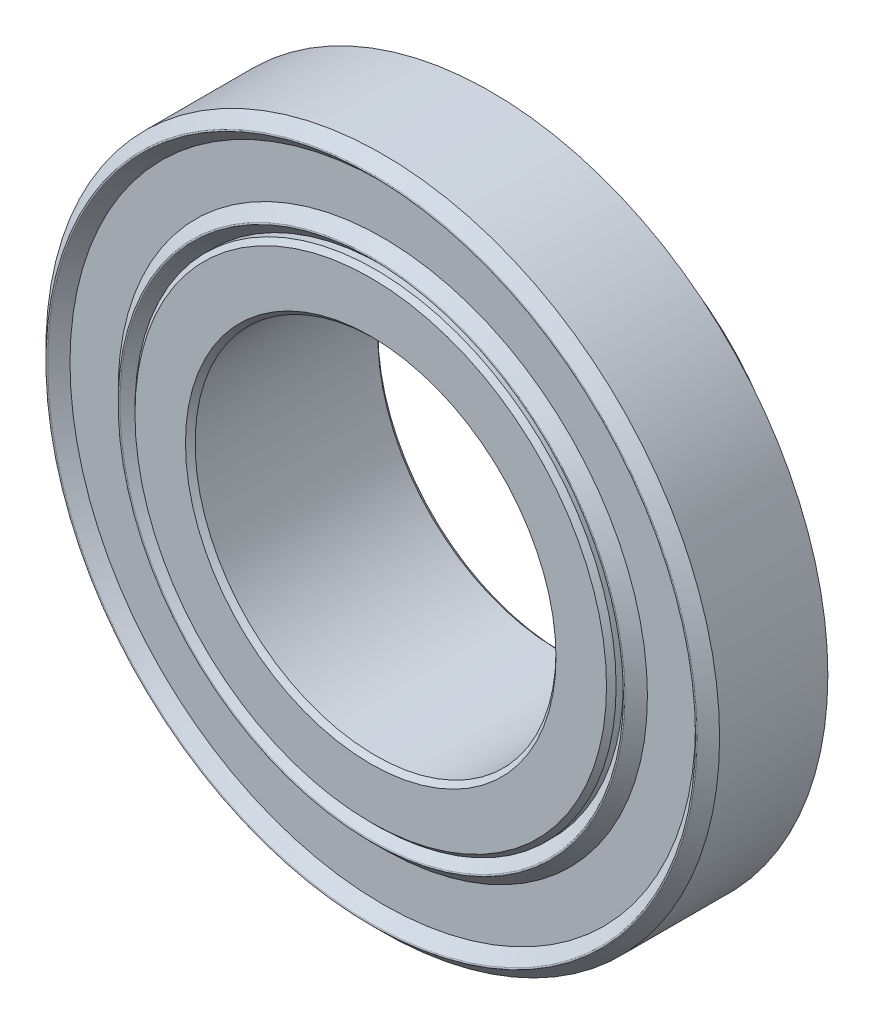
ISO-10303-21;
HEADER;
FILE_DESCRIPTION(('STEP AP214'),'2;1');
FILE_NAME('part.step','',(''),(''),'','','');
FILE_SCHEMA(('AUTOMOTIVE_DESIGN { 1 0 10303 214 1 1 1 1 }'));
ENDSEC;
DATA;
#1=APPLICATION_CONTEXT('core data for automotive mechanical design processes');
#2=APPLICATION_PROTOCOL_DEFINITION('international standard','automotive_design',2000,#1);
#3=PRODUCT_CONTEXT('',#1,'mechanical');
#4=PRODUCT('Part','Part','',(#3));
#5=PRODUCT_RELATED_PRODUCT_CATEGORY('part','',(#4));
#6=PRODUCT_DEFINITION_FORMATION('','',#4);
#7=PRODUCT_DEFINITION_CONTEXT('part definition',#1,'design');
#8=PRODUCT_DEFINITION('design','',#6,#7);
#9=PRODUCT_DEFINITION_SHAPE('','',#8);
#10=(LENGTH_UNIT() NAMED_UNIT(*) SI_UNIT(.MILLI.,.METRE.));
#11=(NAMED_UNIT(*) PLANE_ANGLE_UNIT() SI_UNIT($,.RADIAN.));
#12=(NAMED_UNIT(*) SI_UNIT($,.STERADIAN.) SOLID_ANGLE_UNIT());
#13=UNCERTAINTY_MEASURE_WITH_UNIT(LENGTH_MEASURE(1.E-05),#10,'distance_accuracy_value','');
#14=(GEOMETRIC_REPRESENTATION_CONTEXT(3) GLOBAL_UNCERTAINTY_ASSIGNED_CONTEXT((#13)) GLOBAL_UNIT_ASSIGNED_CONTEXT((#10,
#11,#12)) REPRESENTATION_CONTEXT('',''));
#15=CARTESIAN_POINT('',(0.,0.,0.));
#16=DIRECTION('',(0.,0.,1.));
#17=DIRECTION('',(1.,0.,0.));
#18=AXIS2_PLACEMENT_3D('',#15,#16,#17);
#19=CARTESIAN_POINT('',(0.,0.,-8.));
#20=DIRECTION('',(0.,0.,1.));
#21=DIRECTION('',(1.,0.,0.));
#22=AXIS2_PLACEMENT_3D('',#19,#20,#21);
#23=CYLINDRICAL_SURFACE('',#22,10.);
#24=CARTESIAN_POINT('',(0.,0.,-7.8));
#25=DIRECTION('',(0.,0.,1.));
#26=DIRECTION('',(1.,0.,0.));
#27=AXIS2_PLACEMENT_3D('',#24,#25,#26);
#28=CIRCLE('',#27,10.);
#29=CARTESIAN_POINT('',(10.,0.,-7.8));
#30=VERTEX_POINT('',#29);
#31=EDGE_CURVE('E53',#30,#30,#28,.T.);
#32=ORIENTED_EDGE('',*,*,#31,.T.);
#33=EDGE_LOOP('',(#32));
#34=FACE_BOUND('',#33,.T.);
#35=CARTESIAN_POINT('',(0.,0.,-0.199999999999997));
#36=DIRECTION('',(0.,0.,1.));
#37=DIRECTION('',(1.,0.,0.));
#38=AXIS2_PLACEMENT_3D('',#35,#36,#37);
#39=CIRCLE('',#38,10.);
#40=CARTESIAN_POINT('',(10.,0.,-0.199999999999997));
#41=VERTEX_POINT('',#40);
#42=EDGE_CURVE('E57',#41,#41,#39,.F.);
#43=ORIENTED_EDGE('',*,*,#42,.T.);
#44=EDGE_LOOP('',(#43));
#45=FACE_BOUND('',#44,.T.);
#46=ADVANCED_FACE('F42',(#34,#45),#23,.T.);
#47=CARTESIAN_POINT('',(0.,0.,-8.));
#48=DIRECTION('',(0.,0.,1.));
#49=DIRECTION('',(1.,0.,0.));
#50=AXIS2_PLACEMENT_3D('',#47,#48,#49);
#51=PLANE('',#50);
#52=CARTESIAN_POINT('',(0.,0.,-8.));
#53=DIRECTION('',(0.,0.,1.));
#54=DIRECTION('',(1.,0.,0.));
#55=AXIS2_PLACEMENT_3D('',#52,#53,#54);
#56=CIRCLE('',#55,7.7);
#57=CARTESIAN_POINT('',(7.7,0.,-8.));
#58=VERTEX_POINT('',#57);
#59=EDGE_CURVE('E68',#58,#58,#56,.T.);
#60=ORIENTED_EDGE('',*,*,#59,.T.);
#61=EDGE_LOOP('',(#60));
#62=FACE_BOUND('',#61,.T.);
#63=CARTESIAN_POINT('',(0.,0.,-8.));
#64=DIRECTION('',(0.,0.,1.));
#65=DIRECTION('',(1.,0.,0.));
#66=AXIS2_PLACEMENT_3D('',#63,#64,#65);
#67=CIRCLE('',#66,9.8);
#68=CARTESIAN_POINT('',(9.8,0.,-8.));
#69=VERTEX_POINT('',#68);
#70=EDGE_CURVE('E71',#69,#69,#67,.F.);
#71=ORIENTED_EDGE('',*,*,#70,.T.);
#72=EDGE_LOOP('',(#71));
#73=FACE_BOUND('',#72,.T.);
#74=ADVANCED_FACE('F75',(#62,#73),#51,.F.);
#75=CARTESIAN_POINT('',(0.,0.,0.));
#76=DIRECTION('',(0.,0.,1.));
#77=DIRECTION('',(1.,0.,0.));
#78=AXIS2_PLACEMENT_3D('',#75,#76,#77);
#79=PLANE('',#78);
#80=CARTESIAN_POINT('',(0.,0.,0.));
#81=DIRECTION('',(0.,0.,1.));
#82=DIRECTION('',(1.,0.,0.));
#83=AXIS2_PLACEMENT_3D('',#80,#81,#82);
#84=CIRCLE('',#83,7.7);
#85=CARTESIAN_POINT('',(7.7,0.,0.));
#86=VERTEX_POINT('',#85);
#87=EDGE_CURVE('E11',#86,#86,#84,.F.);
#88=ORIENTED_EDGE('',*,*,#87,.T.);
#89=EDGE_LOOP('',(#88));
#90=FACE_BOUND('',#89,.T.);
#91=CARTESIAN_POINT('',(0.,0.,0.));
#92=DIRECTION('',(0.,0.,1.));
#93=DIRECTION('',(1.,0.,0.));
#94=AXIS2_PLACEMENT_3D('',#91,#92,#93);
#95=CIRCLE('',#94,9.8);
#96=CARTESIAN_POINT('',(9.8,0.,0.));
#97=VERTEX_POINT('',#96);
#98=EDGE_CURVE('E49',#97,#97,#95,.T.);
#99=ORIENTED_EDGE('',*,*,#98,.T.);
#100=EDGE_LOOP('',(#99));
#101=FACE_BOUND('',#100,.T.);
#102=ADVANCED_FACE('F104',(#90,#101),#79,.T.);
#103=CARTESIAN_POINT('',(0.,0.,-8.));
#104=DIRECTION('',(0.,0.,1.));
#105=DIRECTION('',(1.,0.,0.));
#106=AXIS2_PLACEMENT_3D('',#103,#104,#105);
#107=CYLINDRICAL_SURFACE('',#106,7.5);
#108=CARTESIAN_POINT('',(0.,0.,-7.8));
#109=DIRECTION('',(0.,0.,1.));
#110=DIRECTION('',(1.,0.,0.));
#111=AXIS2_PLACEMENT_3D('',#108,#109,#110);
#112=CIRCLE('',#111,7.5);
#113=CARTESIAN_POINT('',(7.5,0.,-7.8));
#114=VERTEX_POINT('',#113);
#115=EDGE_CURVE('E62',#114,#114,#112,.F.);
#116=ORIENTED_EDGE('',*,*,#115,.T.);
#117=EDGE_LOOP('',(#116));
#118=FACE_BOUND('',#117,.T.);
#119=CARTESIAN_POINT('',(0.,0.,-0.200000000000001));
#120=DIRECTION('',(0.,0.,1.));
#121=DIRECTION('',(1.,0.,0.));
#122=AXIS2_PLACEMENT_3D('',#119,#120,#121);
#123=CIRCLE('',#122,7.5);
#124=CARTESIAN_POINT('',(7.5,0.,-0.200000000000001));
#125=VERTEX_POINT('',#124);
#126=EDGE_CURVE('E65',#125,#125,#123,.T.);
#127=ORIENTED_EDGE('',*,*,#126,.T.);
#128=EDGE_LOOP('',(#127));
#129=FACE_BOUND('',#128,.T.);
#130=ADVANCED_FACE('F101',(#118,#129),#107,.F.);
#131=CARTESIAN_POINT('',(0.,0.,-8.));
#132=DIRECTION('',(0.,0.,-1.));
#133=DIRECTION('',(-1.,0.,0.));
#134=AXIS2_PLACEMENT_3D('',#131,#132,#133);
#135=CONICAL_SURFACE('',#134,7.7,0.785398163397448);
#136=ORIENTED_EDGE('',*,*,#115,.F.);
#137=EDGE_LOOP('',(#136));
#138=FACE_BOUND('',#137,.T.);
#139=ORIENTED_EDGE('',*,*,#59,.F.);
#140=EDGE_LOOP('',(#139));
#141=FACE_BOUND('',#140,.T.);
#142=ADVANCED_FACE('F81',(#138,#141),#135,.F.);
#143=CARTESIAN_POINT('',(0.,0.,-7.8));
#144=DIRECTION('',(0.,0.,1.));
#145=DIRECTION('',(1.,0.,0.));
#146=AXIS2_PLACEMENT_3D('',#143,#144,#145);
#147=CONICAL_SURFACE('',#146,10.,0.785398163397444);
#148=ORIENTED_EDGE('',*,*,#70,.F.);
#149=EDGE_LOOP('',(#148));
#150=FACE_BOUND('',#149,.T.);
#151=ORIENTED_EDGE('',*,*,#31,.F.);
#152=EDGE_LOOP('',(#151));
#153=FACE_BOUND('',#152,.T.);
#154=ADVANCED_FACE('F77',(#150,#153),#147,.T.);
#155=CARTESIAN_POINT('',(0.,0.,-0.200000000000001));
#156=DIRECTION('',(0.,0.,1.));
#157=DIRECTION('',(1.,0.,0.));
#158=AXIS2_PLACEMENT_3D('',#155,#156,#157);
#159=CONICAL_SURFACE('',#158,7.5,0.785398163397444);
#160=ORIENTED_EDGE('',*,*,#87,.F.);
#161=EDGE_LOOP('',(#160));
#162=FACE_BOUND('',#161,.T.);
#163=ORIENTED_EDGE('',*,*,#126,.F.);
#164=EDGE_LOOP('',(#163));
#165=FACE_BOUND('',#164,.T.);
#166=ADVANCED_FACE('F80',(#162,#165),#159,.F.);
#167=CARTESIAN_POINT('',(0.,0.,0.));
#168=DIRECTION('',(0.,0.,-1.));
#169=DIRECTION('',(-1.,0.,0.));
#170=AXIS2_PLACEMENT_3D('',#167,#168,#169);
#171=CONICAL_SURFACE('',#170,9.8,0.785398163397457);
#172=ORIENTED_EDGE('',*,*,#42,.F.);
#173=EDGE_LOOP('',(#172));
#174=FACE_BOUND('',#173,.T.);
#175=ORIENTED_EDGE('',*,*,#98,.F.);
#176=EDGE_LOOP('',(#175));
#177=FACE_BOUND('',#176,.T.);
#178=ADVANCED_FACE('F44',(#174,#177),#171,.T.);
#179=CLOSED_SHELL('',(#46,#74,#102,#130,#142,#154,#166,#178));
#180=MANIFOLD_SOLID_BREP('B2',#179);
#181=CARTESIAN_POINT('',(0.,0.,0.));
#182=DIRECTION('',(0.,0.,1.));
#183=DIRECTION('',(1.,0.,0.));
#184=AXIS2_PLACEMENT_3D('',#181,#182,#183);
#185=CYLINDRICAL_SURFACE('',#184,10.);
#186=CARTESIAN_POINT('',(0.,0.,-0.5));
#187=DIRECTION('',(0.,0.,1.));
#188=DIRECTION('',(1.,0.,0.));
#189=AXIS2_PLACEMENT_3D('',#186,#187,#188);
#190=CIRCLE('',#189,10.);
#191=CARTESIAN_POINT('',(10.,0.,-0.5));
#192=VERTEX_POINT('',#191);
#193=EDGE_CURVE('E197',#192,#192,#190,.T.);
#194=ORIENTED_EDGE('',*,*,#193,.T.);
#195=EDGE_LOOP('',(#194));
#196=FACE_BOUND('',#195,.T.);
#197=CARTESIAN_POINT('',(0.,0.,-5.));
#198=DIRECTION('',(0.,0.,1.));
#199=DIRECTION('',(1.,0.,0.));
#200=AXIS2_PLACEMENT_3D('',#197,#198,#199);
#201=CIRCLE('',#200,10.);
#202=CARTESIAN_POINT('',(10.,0.,-5.));
#203=VERTEX_POINT('',#202);
#204=EDGE_CURVE('E41',#203,#203,#201,.T.);
#205=ORIENTED_EDGE('',*,*,#204,.F.);
#206=EDGE_LOOP('',(#205));
#207=FACE_BOUND('',#206,.T.);
#208=ADVANCED_FACE('F163',(#196,#207),#185,.F.);
#209=CARTESIAN_POINT('',(10.,0.,-5.));
#210=DIRECTION('',(0.,0.,-1.));
#211=DIRECTION('',(-1.,0.,0.));
#212=AXIS2_PLACEMENT_3D('',#209,#210,#211);
#213=PLANE('',#212);
#214=ORIENTED_EDGE('',*,*,#204,.T.);
#215=EDGE_LOOP('',(#214));
#216=FACE_BOUND('',#215,.T.);
#217=CARTESIAN_POINT('',(0.,0.,-5.));
#218=DIRECTION('',(0.,0.,1.));
#219=DIRECTION('',(1.,0.,0.));
#220=AXIS2_PLACEMENT_3D('',#217,#218,#219);
#221=CIRCLE('',#220,14.);
#222=CARTESIAN_POINT('',(14.,0.,-5.));
#223=VERTEX_POINT('',#222);
#224=EDGE_CURVE('E169',#223,#223,#221,.T.);
#225=ORIENTED_EDGE('',*,*,#224,.F.);
#226=EDGE_LOOP('',(#225));
#227=FACE_BOUND('',#226,.T.);
#228=ADVANCED_FACE('F215',(#216,#227),#213,.T.);
#229=CARTESIAN_POINT('',(0.,0.,0.));
#230=DIRECTION('',(0.,0.,1.));
#231=DIRECTION('',(1.,0.,0.));
#232=AXIS2_PLACEMENT_3D('',#229,#230,#231);
#233=CYLINDRICAL_SURFACE('',#232,14.);
#234=ORIENTED_EDGE('',*,*,#224,.T.);
#235=EDGE_LOOP('',(#234));
#236=FACE_BOUND('',#235,.T.);
#237=CARTESIAN_POINT('',(0.,0.,-0.5));
#238=DIRECTION('',(0.,0.,1.));
#239=DIRECTION('',(1.,0.,0.));
#240=AXIS2_PLACEMENT_3D('',#237,#238,#239);
#241=CIRCLE('',#240,14.);
#242=CARTESIAN_POINT('',(14.,0.,-0.5));
#243=VERTEX_POINT('',#242);
#244=EDGE_CURVE('E173',#243,#243,#241,.T.);
#245=ORIENTED_EDGE('',*,*,#244,.F.);
#246=EDGE_LOOP('',(#245));
#247=FACE_BOUND('',#246,.T.);
#248=ADVANCED_FACE('F219',(#236,#247),#233,.T.);
#249=CARTESIAN_POINT('',(0.,0.,-0.035355339059327));
#250=DIRECTION('',(0.,0.,-1.));
#251=DIRECTION('',(-1.,0.,0.));
#252=AXIS2_PLACEMENT_3D('',#249,#250,#251);
#253=CONICAL_SURFACE('',#252,13.5353553390593,0.785398163397447);
#254=ORIENTED_EDGE('',*,*,#244,.T.);
#255=EDGE_LOOP('',(#254));
#256=FACE_BOUND('',#255,.T.);
#257=CARTESIAN_POINT('',(0.,0.,-0.035355339059327));
#258=DIRECTION('',(0.,0.,1.));
#259=DIRECTION('',(1.,0.,0.));
#260=AXIS2_PLACEMENT_3D('',#257,#258,#259);
#261=CIRCLE('',#260,13.5353553390593);
#262=CARTESIAN_POINT('',(13.5353553390593,0.,-0.035355339059327));
#263=VERTEX_POINT('',#262);
#264=EDGE_CURVE('E177',#263,#263,#261,.T.);
#265=ORIENTED_EDGE('',*,*,#264,.F.);
#266=EDGE_LOOP('',(#265));
#267=FACE_BOUND('',#266,.T.);
#268=ADVANCED_FACE('F223',(#256,#267),#253,.T.);
#269=CARTESIAN_POINT('',(0.,0.,-0.070710678118654));
#270=DIRECTION('',(0.,0.,1.));
#271=DIRECTION('',(1.,0.,0.));
#272=AXIS2_PLACEMENT_3D('',#269,#270,#271);
#273=TOROIDAL_SURFACE('',#272,13.5,0.0499999999999991);
#274=ORIENTED_EDGE('',*,*,#264,.T.);
#275=EDGE_LOOP('',(#274));
#276=FACE_BOUND('',#275,.T.);
#277=CARTESIAN_POINT('',(0.,0.,-0.0353553390593268));
#278=DIRECTION('',(0.,0.,1.));
#279=DIRECTION('',(1.,0.,0.));
#280=AXIS2_PLACEMENT_3D('',#277,#278,#279);
#281=CIRCLE('',#280,13.4646446609407);
#282=CARTESIAN_POINT('',(13.4646446609407,0.,-0.0353553390593268));
#283=VERTEX_POINT('',#282);
#284=EDGE_CURVE('E182',#283,#283,#281,.T.);
#285=ORIENTED_EDGE('',*,*,#284,.F.);
#286=EDGE_LOOP('',(#285));
#287=FACE_BOUND('',#286,.T.);
#288=ADVANCED_FACE('F229',(#276,#287),#273,.T.);
#289=CARTESIAN_POINT('',(0.,0.,-0.5));
#290=DIRECTION('',(0.,0.,1.));
#291=DIRECTION('',(1.,0.,0.));
#292=AXIS2_PLACEMENT_3D('',#289,#290,#291);
#293=CONICAL_SURFACE('',#292,13.,0.785398163397449);
#294=ORIENTED_EDGE('',*,*,#284,.T.);
#295=EDGE_LOOP('',(#294));
#296=FACE_BOUND('',#295,.T.);
#297=CARTESIAN_POINT('',(0.,0.,-0.5));
#298=DIRECTION('',(0.,0.,1.));
#299=DIRECTION('',(1.,0.,0.));
#300=AXIS2_PLACEMENT_3D('',#297,#298,#299);
#301=CIRCLE('',#300,13.);
#302=CARTESIAN_POINT('',(13.,0.,-0.5));
#303=VERTEX_POINT('',#302);
#304=EDGE_CURVE('E185',#303,#303,#301,.T.);
#305=ORIENTED_EDGE('',*,*,#304,.F.);
#306=EDGE_LOOP('',(#305));
#307=FACE_BOUND('',#306,.T.);
#308=ADVANCED_FACE('F233',(#296,#307),#293,.F.);
#309=CARTESIAN_POINT('',(11.,0.,-0.5));
#310=DIRECTION('',(0.,0.,1.));
#311=DIRECTION('',(1.,0.,0.));
#312=AXIS2_PLACEMENT_3D('',#309,#310,#311);
#313=PLANE('',#312);
#314=ORIENTED_EDGE('',*,*,#304,.T.);
#315=EDGE_LOOP('',(#314));
#316=FACE_BOUND('',#315,.T.);
#317=CARTESIAN_POINT('',(0.,0.,-0.5));
#318=DIRECTION('',(0.,0.,1.));
#319=DIRECTION('',(1.,0.,0.));
#320=AXIS2_PLACEMENT_3D('',#317,#318,#319);
#321=CIRCLE('',#320,11.);
#322=CARTESIAN_POINT('',(11.,0.,-0.5));
#323=VERTEX_POINT('',#322);
#324=EDGE_CURVE('E188',#323,#323,#321,.T.);
#325=ORIENTED_EDGE('',*,*,#324,.F.);
#326=EDGE_LOOP('',(#325));
#327=FACE_BOUND('',#326,.T.);
#328=ADVANCED_FACE('F237',(#316,#327),#313,.T.);
#329=CARTESIAN_POINT('',(0.,0.,-0.0353553390593278));
#330=DIRECTION('',(0.,0.,-1.));
#331=DIRECTION('',(-1.,0.,0.));
#332=AXIS2_PLACEMENT_3D('',#329,#330,#331);
#333=CONICAL_SURFACE('',#332,10.5353553390593,0.785398163397448);
#334=ORIENTED_EDGE('',*,*,#324,.T.);
#335=EDGE_LOOP('',(#334));
#336=FACE_BOUND('',#335,.T.);
#337=CARTESIAN_POINT('',(0.,0.,-0.0353553390593278));
#338=DIRECTION('',(0.,0.,1.));
#339=DIRECTION('',(1.,0.,0.));
#340=AXIS2_PLACEMENT_3D('',#337,#338,#339);
#341=CIRCLE('',#340,10.5353553390593);
#342=CARTESIAN_POINT('',(10.5353553390593,0.,-0.0353553390593278));
#343=VERTEX_POINT('',#342);
#344=EDGE_CURVE('E191',#343,#343,#341,.T.);
#345=ORIENTED_EDGE('',*,*,#344,.F.);
#346=EDGE_LOOP('',(#345));
#347=FACE_BOUND('',#346,.T.);
#348=ADVANCED_FACE('F211',(#336,#347),#333,.T.);
#349=CARTESIAN_POINT('',(0.,0.,-0.0707106781186542));
#350=DIRECTION('',(0.,0.,1.));
#351=DIRECTION('',(1.,0.,0.));
#352=AXIS2_PLACEMENT_3D('',#349,#350,#351);
#353=TOROIDAL_SURFACE('',#352,10.5,0.0499999999999988);
#354=ORIENTED_EDGE('',*,*,#344,.T.);
#355=EDGE_LOOP('',(#354));
#356=FACE_BOUND('',#355,.T.);
#357=CARTESIAN_POINT('',(0.,0.,-0.0353553390593277));
#358=DIRECTION('',(0.,0.,1.));
#359=DIRECTION('',(1.,0.,0.));
#360=AXIS2_PLACEMENT_3D('',#357,#358,#359);
#361=CIRCLE('',#360,10.4646446609407);
#362=CARTESIAN_POINT('',(10.4646446609407,0.,-0.0353553390593277));
#363=VERTEX_POINT('',#362);
#364=EDGE_CURVE('E194',#363,#363,#361,.T.);
#365=ORIENTED_EDGE('',*,*,#364,.F.);
#366=EDGE_LOOP('',(#365));
#367=FACE_BOUND('',#366,.T.);
#368=ADVANCED_FACE('F205',(#356,#367),#353,.T.);
#369=CARTESIAN_POINT('',(0.,0.,-0.5));
#370=DIRECTION('',(0.,0.,1.));
#371=DIRECTION('',(1.,0.,0.));
#372=AXIS2_PLACEMENT_3D('',#369,#370,#371);
#373=CONICAL_SURFACE('',#372,10.,0.78539816339745);
#374=ORIENTED_EDGE('',*,*,#364,.T.);
#375=EDGE_LOOP('',(#374));
#376=FACE_BOUND('',#375,.T.);
#377=ORIENTED_EDGE('',*,*,#193,.F.);
#378=EDGE_LOOP('',(#377));
#379=FACE_BOUND('',#378,.T.);
#380=ADVANCED_FACE('F203',(#376,#379),#373,.F.);
#381=CLOSED_SHELL('',(#208,#228,#248,#268,#288,#308,#328,#348,#368,#380));
#382=MANIFOLD_SOLID_BREP('B6',#381);
#383=ADVANCED_BREP_SHAPE_REPRESENTATION('',(#18,#180,#382),#14);
#384=SHAPE_DEFINITION_REPRESENTATION(#9,#383);
ENDSEC;
END-ISO-10303-21;
